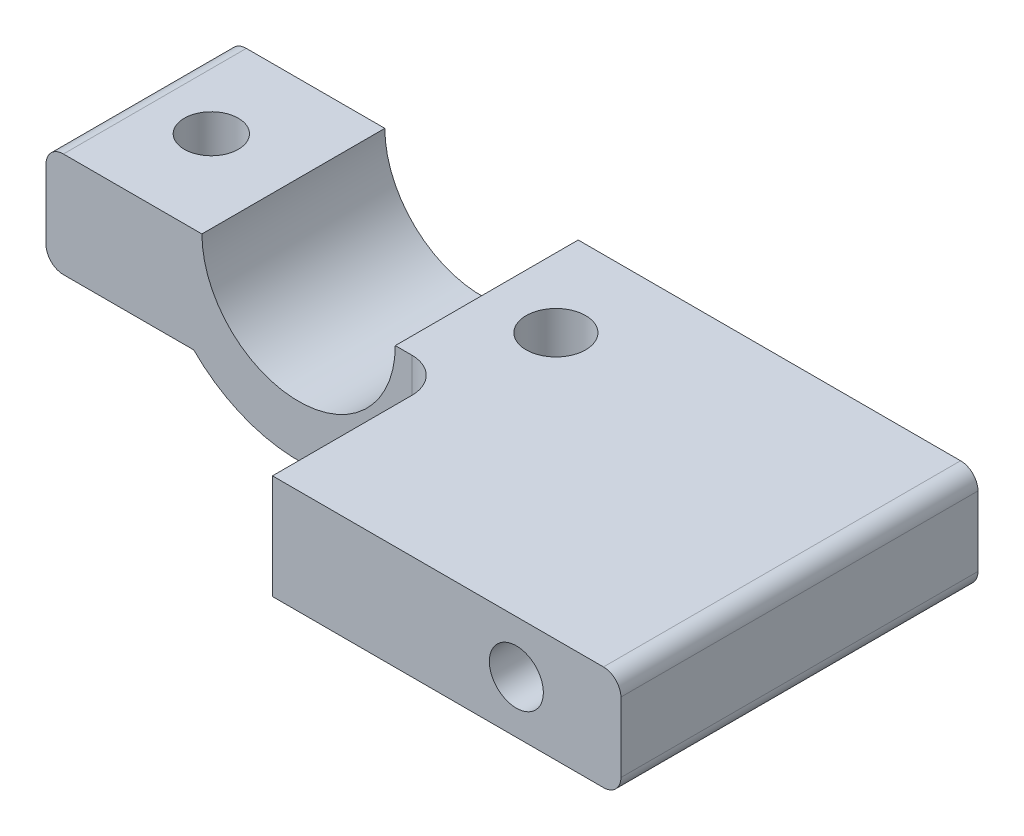
ISO-10303-21;
HEADER;
FILE_DESCRIPTION(('STEP AP214'),'2;1');
FILE_NAME('part.step','',(''),(''),'','','');
FILE_SCHEMA(('AUTOMOTIVE_DESIGN { 1 0 10303 214 1 1 1 1 }'));
ENDSEC;
DATA;
#1=APPLICATION_CONTEXT('core data for automotive mechanical design processes');
#2=APPLICATION_PROTOCOL_DEFINITION('international standard','automotive_design',2000,#1);
#3=PRODUCT_CONTEXT('',#1,'mechanical');
#4=PRODUCT('Part','Part','',(#3));
#5=PRODUCT_RELATED_PRODUCT_CATEGORY('part','',(#4));
#6=PRODUCT_DEFINITION_FORMATION('','',#4);
#7=PRODUCT_DEFINITION_CONTEXT('part definition',#1,'design');
#8=PRODUCT_DEFINITION('design','',#6,#7);
#9=PRODUCT_DEFINITION_SHAPE('','',#8);
#10=(LENGTH_UNIT() NAMED_UNIT(*) SI_UNIT(.MILLI.,.METRE.));
#11=(NAMED_UNIT(*) PLANE_ANGLE_UNIT() SI_UNIT($,.RADIAN.));
#12=(NAMED_UNIT(*) SI_UNIT($,.STERADIAN.) SOLID_ANGLE_UNIT());
#13=UNCERTAINTY_MEASURE_WITH_UNIT(LENGTH_MEASURE(1.E-05),#10,'distance_accuracy_value','');
#14=(GEOMETRIC_REPRESENTATION_CONTEXT(3) GLOBAL_UNCERTAINTY_ASSIGNED_CONTEXT((#13)) GLOBAL_UNIT_ASSIGNED_CONTEXT((#10,
#11,#12)) REPRESENTATION_CONTEXT('',''));
#15=CARTESIAN_POINT('',(0.,0.,0.));
#16=DIRECTION('',(0.,0.,1.));
#17=DIRECTION('',(1.,0.,0.));
#18=AXIS2_PLACEMENT_3D('',#15,#16,#17);
#19=CARTESIAN_POINT('',(0.,-6.,10.5));
#20=DIRECTION('',(0.,1.,0.));
#21=DIRECTION('',(0.,0.,1.));
#22=AXIS2_PLACEMENT_3D('',#19,#20,#21);
#23=PLANE('',#22);
#24=CARTESIAN_POINT('',(-10.2603986446981,-6.,5.25));
#25=DIRECTION('',(0.,-1.,0.));
#26=DIRECTION('',(0.,0.,-1.));
#27=AXIS2_PLACEMENT_3D('',#24,#25,#26);
#28=CIRCLE('',#27,1.55);
#29=CARTESIAN_POINT('',(-10.2603986446981,-6.,3.7));
#30=VERTEX_POINT('',#29);
#31=EDGE_CURVE('E199',#30,#30,#28,.T.);
#32=ORIENTED_EDGE('',*,*,#31,.F.);
#33=EDGE_LOOP('',(#32));
#34=FACE_BOUND('',#33,.T.);
#35=DIRECTION('',(1.,0.,0.));
#36=VECTOR('',#35,1.);
#37=CARTESIAN_POINT('',(0.,-6.,10.5));
#38=LINE('',#37,#36);
#39=CARTESIAN_POINT('',(-13.5,-6.,10.5));
#40=VERTEX_POINT('',#39);
#41=CARTESIAN_POINT('',(-6.02079728939615,-6.,10.5));
#42=VERTEX_POINT('',#41);
#43=EDGE_CURVE('E211',#40,#42,#38,.T.);
#44=ORIENTED_EDGE('',*,*,#43,.F.);
#45=DIRECTION('',(0.,0.,-1.));
#46=VECTOR('',#45,1.);
#47=CARTESIAN_POINT('',(-13.5,-6.,10.5));
#48=LINE('',#47,#46);
#49=CARTESIAN_POINT('',(-13.5,-6.,0.));
#50=VERTEX_POINT('',#49);
#51=EDGE_CURVE('E316',#40,#50,#48,.T.);
#52=ORIENTED_EDGE('',*,*,#51,.T.);
#53=DIRECTION('',(1.,0.,0.));
#54=VECTOR('',#53,1.);
#55=CARTESIAN_POINT('',(0.,-6.,0.));
#56=LINE('',#55,#54);
#57=CARTESIAN_POINT('',(-6.02079728939615,-6.,0.));
#58=VERTEX_POINT('',#57);
#59=EDGE_CURVE('E207',#50,#58,#56,.T.);
#60=ORIENTED_EDGE('',*,*,#59,.T.);
#61=DIRECTION('',(0.,0.,-1.));
#62=VECTOR('',#61,1.);
#63=CARTESIAN_POINT('',(-6.02079728939615,-6.,10.5));
#64=LINE('',#63,#62);
#65=EDGE_CURVE('E271',#42,#58,#64,.T.);
#66=ORIENTED_EDGE('',*,*,#65,.F.);
#67=EDGE_LOOP('',(#44,#52,#60,#66));
#68=FACE_BOUND('',#67,.T.);
#69=ADVANCED_FACE('F45',(#34,#68),#23,.F.);
#70=CARTESIAN_POINT('',(0.,0.,10.5));
#71=DIRECTION('',(0.,0.,-1.));
#72=DIRECTION('',(-1.,0.,0.));
#73=AXIS2_PLACEMENT_3D('',#70,#71,#72);
#74=CYLINDRICAL_SURFACE('',#73,8.5);
#75=CARTESIAN_POINT('',(0.,0.,0.));
#76=DIRECTION('',(0.,0.,1.));
#77=DIRECTION('',(1.,0.,0.));
#78=AXIS2_PLACEMENT_3D('',#75,#76,#77);
#79=CIRCLE('',#78,8.5);
#80=CARTESIAN_POINT('',(6.02079728939615,-6.,0.));
#81=VERTEX_POINT('',#80);
#82=EDGE_CURVE('E238',#58,#81,#79,.T.);
#83=ORIENTED_EDGE('',*,*,#82,.T.);
#84=DIRECTION('',(0.,0.,-1.));
#85=VECTOR('',#84,1.);
#86=CARTESIAN_POINT('',(6.02079728939615,-6.,10.5));
#87=LINE('',#86,#85);
#88=CARTESIAN_POINT('',(6.02079728939615,-6.,10.5));
#89=VERTEX_POINT('',#88);
#90=EDGE_CURVE('E267',#89,#81,#87,.T.);
#91=ORIENTED_EDGE('',*,*,#90,.F.);
#92=CARTESIAN_POINT('',(0.,0.,10.5));
#93=DIRECTION('',(0.,0.,1.));
#94=DIRECTION('',(1.,0.,0.));
#95=AXIS2_PLACEMENT_3D('',#92,#93,#94);
#96=CIRCLE('',#95,8.5);
#97=EDGE_CURVE('E214',#42,#89,#96,.T.);
#98=ORIENTED_EDGE('',*,*,#97,.F.);
#99=ORIENTED_EDGE('',*,*,#65,.T.);
#100=EDGE_LOOP('',(#83,#91,#98,#99));
#101=FACE_BOUND('',#100,.T.);
#102=ADVANCED_FACE('F390',(#101),#74,.T.);
#103=CARTESIAN_POINT('',(0.,-6.,10.5));
#104=DIRECTION('',(0.,-1.,0.));
#105=DIRECTION('',(1.,0.,0.));
#106=AXIS2_PLACEMENT_3D('',#103,#104,#105);
#107=PLANE('',#106);
#108=CARTESIAN_POINT('',(9.52079728939614,-6.,5.25));
#109=DIRECTION('',(0.,-1.,0.));
#110=DIRECTION('',(1.,0.,0.));
#111=AXIS2_PLACEMENT_3D('',#108,#109,#110);
#112=CIRCLE('',#111,1.70728631001392);
#113=CARTESIAN_POINT('',(11.2280835994101,-6.,5.25));
#114=VERTEX_POINT('',#113);
#115=EDGE_CURVE('E180',#114,#114,#112,.T.);
#116=ORIENTED_EDGE('',*,*,#115,.F.);
#117=EDGE_LOOP('',(#116));
#118=FACE_BOUND('',#117,.T.);
#119=DIRECTION('',(-1.,0.,0.));
#120=VECTOR('',#119,1.);
#121=CARTESIAN_POINT('',(0.,-6.,0.));
#122=LINE('',#121,#120);
#123=CARTESIAN_POINT('',(27.5,-6.,0.));
#124=VERTEX_POINT('',#123);
#125=EDGE_CURVE('E242',#124,#81,#122,.T.);
#126=ORIENTED_EDGE('',*,*,#125,.F.);
#127=DIRECTION('',(0.,0.,-1.));
#128=VECTOR('',#127,1.);
#129=CARTESIAN_POINT('',(27.5,-6.,10.5));
#130=LINE('',#129,#128);
#131=CARTESIAN_POINT('',(27.5,-6.,20.5));
#132=VERTEX_POINT('',#131);
#133=EDGE_CURVE('E313',#124,#132,#130,.F.);
#134=ORIENTED_EDGE('',*,*,#133,.T.);
#135=DIRECTION('',(1.,0.,0.));
#136=VECTOR('',#135,1.);
#137=CARTESIAN_POINT('',(28.5,-6.,20.5));
#138=LINE('',#137,#136);
#139=CARTESIAN_POINT('',(8.5,-6.,20.5));
#140=VERTEX_POINT('',#139);
#141=EDGE_CURVE('E187',#140,#132,#138,.T.);
#142=ORIENTED_EDGE('',*,*,#141,.F.);
#143=DIRECTION('',(0.,0.,-1.));
#144=VECTOR('',#143,1.);
#145=CARTESIAN_POINT('',(8.5,-6.,20.5));
#146=LINE('',#145,#144);
#147=CARTESIAN_POINT('',(8.5,-6.,12.5));
#148=VERTEX_POINT('',#147);
#149=EDGE_CURVE('E181',#140,#148,#146,.T.);
#150=ORIENTED_EDGE('',*,*,#149,.T.);
#151=CARTESIAN_POINT('',(6.5,-6.,12.5));
#152=DIRECTION('',(0.,-1.,0.));
#153=DIRECTION('',(1.,0.,0.));
#154=AXIS2_PLACEMENT_3D('',#151,#152,#153);
#155=CIRCLE('',#154,2.);
#156=CARTESIAN_POINT('',(6.5,-6.,10.5));
#157=VERTEX_POINT('',#156);
#158=EDGE_CURVE('E281',#148,#157,#155,.F.);
#159=ORIENTED_EDGE('',*,*,#158,.T.);
#160=DIRECTION('',(-1.,0.,0.));
#161=VECTOR('',#160,1.);
#162=CARTESIAN_POINT('',(0.,-6.,10.5));
#163=LINE('',#162,#161);
#164=EDGE_CURVE('E219',#157,#89,#163,.T.);
#165=ORIENTED_EDGE('',*,*,#164,.T.);
#166=ORIENTED_EDGE('',*,*,#90,.T.);
#167=EDGE_LOOP('',(#126,#134,#142,#150,#159,#165,#166));
#168=FACE_BOUND('',#167,.T.);
#169=ADVANCED_FACE('F396',(#118,#168),#107,.T.);
#170=CARTESIAN_POINT('',(28.5,0.,10.5));
#171=DIRECTION('',(1.,0.,0.));
#172=DIRECTION('',(0.,0.,-1.));
#173=AXIS2_PLACEMENT_3D('',#170,#171,#172);
#174=PLANE('',#173);
#175=DIRECTION('',(0.,-1.,0.));
#176=VECTOR('',#175,1.);
#177=CARTESIAN_POINT('',(28.5,0.,0.));
#178=LINE('',#177,#176);
#179=CARTESIAN_POINT('',(28.5,-1.,0.));
#180=VERTEX_POINT('',#179);
#181=CARTESIAN_POINT('',(28.5,-5.,0.));
#182=VERTEX_POINT('',#181);
#183=EDGE_CURVE('E245',#180,#182,#178,.T.);
#184=ORIENTED_EDGE('',*,*,#183,.F.);
#185=DIRECTION('',(0.,0.,-1.));
#186=VECTOR('',#185,1.);
#187=CARTESIAN_POINT('',(28.5,-1.,10.5));
#188=LINE('',#187,#186);
#189=CARTESIAN_POINT('',(28.5,-1.,20.5));
#190=VERTEX_POINT('',#189);
#191=EDGE_CURVE('E305',#180,#190,#188,.F.);
#192=ORIENTED_EDGE('',*,*,#191,.T.);
#193=DIRECTION('',(0.,1.,0.));
#194=VECTOR('',#193,1.);
#195=CARTESIAN_POINT('',(28.5,-6.,20.5));
#196=LINE('',#195,#194);
#197=CARTESIAN_POINT('',(28.5,-5.,20.5));
#198=VERTEX_POINT('',#197);
#199=EDGE_CURVE('E168',#198,#190,#196,.T.);
#200=ORIENTED_EDGE('',*,*,#199,.F.);
#201=DIRECTION('',(0.,0.,-1.));
#202=VECTOR('',#201,1.);
#203=CARTESIAN_POINT('',(28.5,-5.,10.5));
#204=LINE('',#203,#202);
#205=EDGE_CURVE('E301',#198,#182,#204,.T.);
#206=ORIENTED_EDGE('',*,*,#205,.T.);
#207=EDGE_LOOP('',(#184,#192,#200,#206));
#208=FACE_BOUND('',#207,.T.);
#209=ADVANCED_FACE('F362',(#208),#174,.T.);
#210=CARTESIAN_POINT('',(0.,0.,10.5));
#211=DIRECTION('',(0.,1.,0.));
#212=DIRECTION('',(0.,0.,1.));
#213=AXIS2_PLACEMENT_3D('',#210,#211,#212);
#214=PLANE('',#213);
#215=CARTESIAN_POINT('',(9.52079728939614,0.,5.25));
#216=DIRECTION('',(0.,-1.,0.));
#217=DIRECTION('',(1.,0.,0.));
#218=AXIS2_PLACEMENT_3D('',#215,#216,#217);
#219=CIRCLE('',#218,1.70728631001392);
#220=CARTESIAN_POINT('',(11.2280835994101,0.,5.25));
#221=VERTEX_POINT('',#220);
#222=EDGE_CURVE('E195',#221,#221,#219,.T.);
#223=ORIENTED_EDGE('',*,*,#222,.T.);
#224=EDGE_LOOP('',(#223));
#225=FACE_BOUND('',#224,.T.);
#226=DIRECTION('',(-1.,0.,0.));
#227=VECTOR('',#226,1.);
#228=CARTESIAN_POINT('',(28.5,0.,20.5));
#229=LINE('',#228,#227);
#230=CARTESIAN_POINT('',(27.5,0.,20.5));
#231=VERTEX_POINT('',#230);
#232=CARTESIAN_POINT('',(8.5,0.,20.5));
#233=VERTEX_POINT('',#232);
#234=EDGE_CURVE('E154',#231,#233,#229,.T.);
#235=ORIENTED_EDGE('',*,*,#234,.F.);
#236=DIRECTION('',(0.,0.,-1.));
#237=VECTOR('',#236,1.);
#238=CARTESIAN_POINT('',(27.5,0.,10.5));
#239=LINE('',#238,#237);
#240=CARTESIAN_POINT('',(27.5,0.,0.));
#241=VERTEX_POINT('',#240);
#242=EDGE_CURVE('E286',#231,#241,#239,.T.);
#243=ORIENTED_EDGE('',*,*,#242,.T.);
#244=DIRECTION('',(1.,0.,0.));
#245=VECTOR('',#244,1.);
#246=CARTESIAN_POINT('',(0.,0.,0.));
#247=LINE('',#246,#245);
#248=CARTESIAN_POINT('',(5.55,0.,0.));
#249=VERTEX_POINT('',#248);
#250=EDGE_CURVE('E249',#249,#241,#247,.T.);
#251=ORIENTED_EDGE('',*,*,#250,.F.);
#252=DIRECTION('',(0.,0.,-1.));
#253=VECTOR('',#252,1.);
#254=CARTESIAN_POINT('',(5.55,0.,10.5));
#255=LINE('',#254,#253);
#256=CARTESIAN_POINT('',(5.55,0.,10.5));
#257=VERTEX_POINT('',#256);
#258=EDGE_CURVE('E264',#257,#249,#255,.T.);
#259=ORIENTED_EDGE('',*,*,#258,.F.);
#260=DIRECTION('',(1.,0.,0.));
#261=VECTOR('',#260,1.);
#262=CARTESIAN_POINT('',(0.,0.,10.5));
#263=LINE('',#262,#261);
#264=CARTESIAN_POINT('',(6.5,0.,10.5));
#265=VERTEX_POINT('',#264);
#266=EDGE_CURVE('E222',#257,#265,#263,.T.);
#267=ORIENTED_EDGE('',*,*,#266,.T.);
#268=CARTESIAN_POINT('',(6.5,0.,12.5));
#269=DIRECTION('',(0.,1.,0.));
#270=DIRECTION('',(0.,0.,1.));
#271=AXIS2_PLACEMENT_3D('',#268,#269,#270);
#272=CIRCLE('',#271,2.);
#273=CARTESIAN_POINT('',(8.5,0.,12.5));
#274=VERTEX_POINT('',#273);
#275=EDGE_CURVE('E175',#265,#274,#272,.F.);
#276=ORIENTED_EDGE('',*,*,#275,.T.);
#277=DIRECTION('',(0.,0.,-1.));
#278=VECTOR('',#277,1.);
#279=CARTESIAN_POINT('',(8.5,0.,20.5));
#280=LINE('',#279,#278);
#281=EDGE_CURVE('E171',#233,#274,#280,.T.);
#282=ORIENTED_EDGE('',*,*,#281,.F.);
#283=EDGE_LOOP('',(#235,#243,#251,#259,#267,#276,#282));
#284=FACE_BOUND('',#283,.T.);
#285=ADVANCED_FACE('F172',(#225,#284),#214,.T.);
#286=CARTESIAN_POINT('',(0.,0.,10.5));
#287=DIRECTION('',(0.,0.,-1.));
#288=DIRECTION('',(-1.,0.,0.));
#289=AXIS2_PLACEMENT_3D('',#286,#287,#288);
#290=CYLINDRICAL_SURFACE('',#289,5.55);
#291=CARTESIAN_POINT('',(0.,0.,0.));
#292=DIRECTION('',(0.,0.,1.));
#293=DIRECTION('',(1.,0.,0.));
#294=AXIS2_PLACEMENT_3D('',#291,#292,#293);
#295=CIRCLE('',#294,5.55);
#296=CARTESIAN_POINT('',(-5.55,0.,0.));
#297=VERTEX_POINT('',#296);
#298=EDGE_CURVE('E253',#297,#249,#295,.T.);
#299=ORIENTED_EDGE('',*,*,#298,.F.);
#300=DIRECTION('',(0.,0.,-1.));
#301=VECTOR('',#300,1.);
#302=CARTESIAN_POINT('',(-5.55,0.,10.5));
#303=LINE('',#302,#301);
#304=CARTESIAN_POINT('',(-5.55,0.,10.5));
#305=VERTEX_POINT('',#304);
#306=EDGE_CURVE('E235',#305,#297,#303,.T.);
#307=ORIENTED_EDGE('',*,*,#306,.F.);
#308=CARTESIAN_POINT('',(0.,0.,10.5));
#309=DIRECTION('',(0.,0.,1.));
#310=DIRECTION('',(1.,0.,0.));
#311=AXIS2_PLACEMENT_3D('',#308,#309,#310);
#312=CIRCLE('',#311,5.55);
#313=EDGE_CURVE('E225',#305,#257,#312,.T.);
#314=ORIENTED_EDGE('',*,*,#313,.T.);
#315=ORIENTED_EDGE('',*,*,#258,.T.);
#316=EDGE_LOOP('',(#299,#307,#314,#315));
#317=FACE_BOUND('',#316,.T.);
#318=ADVANCED_FACE('F353',(#317),#290,.F.);
#319=CARTESIAN_POINT('',(0.,0.,10.5));
#320=DIRECTION('',(0.,-1.,0.));
#321=DIRECTION('',(1.,0.,0.));
#322=AXIS2_PLACEMENT_3D('',#319,#320,#321);
#323=PLANE('',#322);
#324=CARTESIAN_POINT('',(-10.2603986446981,0.,5.25));
#325=DIRECTION('',(0.,-1.,0.));
#326=DIRECTION('',(0.,0.,-1.));
#327=AXIS2_PLACEMENT_3D('',#324,#325,#326);
#328=CIRCLE('',#327,1.55);
#329=CARTESIAN_POINT('',(-10.2603986446981,0.,3.7));
#330=VERTEX_POINT('',#329);
#331=EDGE_CURVE('E203',#330,#330,#328,.T.);
#332=ORIENTED_EDGE('',*,*,#331,.T.);
#333=EDGE_LOOP('',(#332));
#334=FACE_BOUND('',#333,.T.);
#335=DIRECTION('',(-1.,0.,0.));
#336=VECTOR('',#335,1.);
#337=CARTESIAN_POINT('',(0.,0.,0.));
#338=LINE('',#337,#336);
#339=CARTESIAN_POINT('',(-13.5,0.,0.));
#340=VERTEX_POINT('',#339);
#341=EDGE_CURVE('E257',#297,#340,#338,.T.);
#342=ORIENTED_EDGE('',*,*,#341,.T.);
#343=DIRECTION('',(0.,0.,-1.));
#344=VECTOR('',#343,1.);
#345=CARTESIAN_POINT('',(-13.5,0.,10.5));
#346=LINE('',#345,#344);
#347=CARTESIAN_POINT('',(-13.5,0.,10.5));
#348=VERTEX_POINT('',#347);
#349=EDGE_CURVE('E11',#340,#348,#346,.F.);
#350=ORIENTED_EDGE('',*,*,#349,.T.);
#351=DIRECTION('',(-1.,0.,0.));
#352=VECTOR('',#351,1.);
#353=CARTESIAN_POINT('',(0.,0.,10.5));
#354=LINE('',#353,#352);
#355=EDGE_CURVE('E229',#305,#348,#354,.T.);
#356=ORIENTED_EDGE('',*,*,#355,.F.);
#357=ORIENTED_EDGE('',*,*,#306,.T.);
#358=EDGE_LOOP('',(#342,#350,#356,#357));
#359=FACE_BOUND('',#358,.T.);
#360=ADVANCED_FACE('F350',(#334,#359),#323,.F.);
#361=CARTESIAN_POINT('',(-14.5,0.,10.5));
#362=DIRECTION('',(1.,0.,0.));
#363=DIRECTION('',(0.,0.,-1.));
#364=AXIS2_PLACEMENT_3D('',#361,#362,#363);
#365=PLANE('',#364);
#366=DIRECTION('',(0.,-1.,0.));
#367=VECTOR('',#366,1.);
#368=CARTESIAN_POINT('',(-14.5,0.,0.));
#369=LINE('',#368,#367);
#370=CARTESIAN_POINT('',(-14.5,-1.,0.));
#371=VERTEX_POINT('',#370);
#372=CARTESIAN_POINT('',(-14.5,-5.,0.));
#373=VERTEX_POINT('',#372);
#374=EDGE_CURVE('E215',#371,#373,#369,.T.);
#375=ORIENTED_EDGE('',*,*,#374,.T.);
#376=DIRECTION('',(0.,0.,-1.));
#377=VECTOR('',#376,1.);
#378=CARTESIAN_POINT('',(-14.5,-5.,10.5));
#379=LINE('',#378,#377);
#380=CARTESIAN_POINT('',(-14.5,-5.,10.5));
#381=VERTEX_POINT('',#380);
#382=EDGE_CURVE('E67',#373,#381,#379,.F.);
#383=ORIENTED_EDGE('',*,*,#382,.T.);
#384=DIRECTION('',(0.,-1.,0.));
#385=VECTOR('',#384,1.);
#386=CARTESIAN_POINT('',(-14.5,0.,10.5));
#387=LINE('',#386,#385);
#388=CARTESIAN_POINT('',(-14.5,-1.,10.5));
#389=VERTEX_POINT('',#388);
#390=EDGE_CURVE('E232',#389,#381,#387,.T.);
#391=ORIENTED_EDGE('',*,*,#390,.F.);
#392=DIRECTION('',(0.,0.,-1.));
#393=VECTOR('',#392,1.);
#394=CARTESIAN_POINT('',(-14.5,-1.,10.5));
#395=LINE('',#394,#393);
#396=EDGE_CURVE('E320',#389,#371,#395,.T.);
#397=ORIENTED_EDGE('',*,*,#396,.T.);
#398=EDGE_LOOP('',(#375,#383,#391,#397));
#399=FACE_BOUND('',#398,.T.);
#400=ADVANCED_FACE('F344',(#399),#365,.F.);
#401=CARTESIAN_POINT('',(0.,0.,10.5));
#402=DIRECTION('',(0.,0.,1.));
#403=DIRECTION('',(1.,0.,0.));
#404=AXIS2_PLACEMENT_3D('',#401,#402,#403);
#405=PLANE('',#404);
#406=ORIENTED_EDGE('',*,*,#390,.T.);
#407=CARTESIAN_POINT('',(-13.5,-5.,10.5));
#408=DIRECTION('',(0.,0.,1.));
#409=DIRECTION('',(1.,0.,0.));
#410=AXIS2_PLACEMENT_3D('',#407,#408,#409);
#411=CIRCLE('',#410,1.);
#412=EDGE_CURVE('E54',#381,#40,#411,.T.);
#413=ORIENTED_EDGE('',*,*,#412,.T.);
#414=ORIENTED_EDGE('',*,*,#43,.T.);
#415=ORIENTED_EDGE('',*,*,#97,.T.);
#416=ORIENTED_EDGE('',*,*,#164,.F.);
#417=DIRECTION('',(0.,-1.,0.));
#418=VECTOR('',#417,1.);
#419=CARTESIAN_POINT('',(6.5,0.,10.5));
#420=LINE('',#419,#418);
#421=EDGE_CURVE('E278',#157,#265,#420,.F.);
#422=ORIENTED_EDGE('',*,*,#421,.T.);
#423=ORIENTED_EDGE('',*,*,#266,.F.);
#424=ORIENTED_EDGE('',*,*,#313,.F.);
#425=ORIENTED_EDGE('',*,*,#355,.T.);
#426=CARTESIAN_POINT('',(-13.5,-1.,10.5));
#427=DIRECTION('',(0.,0.,1.));
#428=DIRECTION('',(1.,0.,0.));
#429=AXIS2_PLACEMENT_3D('',#426,#427,#428);
#430=CIRCLE('',#429,1.);
#431=EDGE_CURVE('E326',#348,#389,#430,.T.);
#432=ORIENTED_EDGE('',*,*,#431,.T.);
#433=EDGE_LOOP('',(#406,#413,#414,#415,#416,#422,#423,#424,#425,#432));
#434=FACE_BOUND('',#433,.T.);
#435=ADVANCED_FACE('F332',(#434),#405,.T.);
#436=CARTESIAN_POINT('',(0.,0.,0.));
#437=DIRECTION('',(0.,0.,1.));
#438=DIRECTION('',(1.,0.,0.));
#439=AXIS2_PLACEMENT_3D('',#436,#437,#438);
#440=PLANE('',#439);
#441=ORIENTED_EDGE('',*,*,#250,.T.);
#442=CARTESIAN_POINT('',(27.5,-1.,0.));
#443=DIRECTION('',(0.,0.,1.));
#444=DIRECTION('',(1.,0.,0.));
#445=AXIS2_PLACEMENT_3D('',#442,#443,#444);
#446=CIRCLE('',#445,1.);
#447=EDGE_CURVE('E298',#241,#180,#446,.F.);
#448=ORIENTED_EDGE('',*,*,#447,.T.);
#449=ORIENTED_EDGE('',*,*,#183,.T.);
#450=CARTESIAN_POINT('',(27.5,-5.,0.));
#451=DIRECTION('',(0.,0.,1.));
#452=DIRECTION('',(1.,0.,0.));
#453=AXIS2_PLACEMENT_3D('',#450,#451,#452);
#454=CIRCLE('',#453,1.);
#455=EDGE_CURVE('E295',#182,#124,#454,.F.);
#456=ORIENTED_EDGE('',*,*,#455,.T.);
#457=ORIENTED_EDGE('',*,*,#125,.T.);
#458=ORIENTED_EDGE('',*,*,#82,.F.);
#459=ORIENTED_EDGE('',*,*,#59,.F.);
#460=CARTESIAN_POINT('',(-13.5,-5.,0.));
#461=DIRECTION('',(0.,0.,1.));
#462=DIRECTION('',(1.,0.,0.));
#463=AXIS2_PLACEMENT_3D('',#460,#461,#462);
#464=CIRCLE('',#463,1.);
#465=EDGE_CURVE('E292',#50,#373,#464,.F.);
#466=ORIENTED_EDGE('',*,*,#465,.T.);
#467=ORIENTED_EDGE('',*,*,#374,.F.);
#468=CARTESIAN_POINT('',(-13.5,-1.,0.));
#469=DIRECTION('',(0.,0.,1.));
#470=DIRECTION('',(1.,0.,0.));
#471=AXIS2_PLACEMENT_3D('',#468,#469,#470);
#472=CIRCLE('',#471,1.);
#473=EDGE_CURVE('E289',#371,#340,#472,.F.);
#474=ORIENTED_EDGE('',*,*,#473,.T.);
#475=ORIENTED_EDGE('',*,*,#341,.F.);
#476=ORIENTED_EDGE('',*,*,#298,.T.);
#477=EDGE_LOOP('',(#441,#448,#449,#456,#457,#458,#459,#466,#467,#474,#475,#476));
#478=FACE_BOUND('',#477,.T.);
#479=ADVANCED_FACE('F342',(#478),#440,.F.);
#480=CARTESIAN_POINT('',(-10.2603986446981,0.,5.25));
#481=DIRECTION('',(0.,-1.,0.));
#482=DIRECTION('',(0.,0.,-1.));
#483=AXIS2_PLACEMENT_3D('',#480,#481,#482);
#484=CYLINDRICAL_SURFACE('',#483,1.55);
#485=CARTESIAN_POINT('',(-10.2603986446981,0.,3.7));
#486=CARTESIAN_POINT('',(-10.2603986446981,-0.0624999999999999,3.7));
#487=CARTESIAN_POINT('',(-10.2603986446981,-0.125,3.7));
#488=CARTESIAN_POINT('',(-10.2603986446981,-0.25,3.7));
#489=CARTESIAN_POINT('',(-10.2603986446981,-0.3125,3.7));
#490=CARTESIAN_POINT('',(-10.2603986446981,-0.4375,3.7));
#491=CARTESIAN_POINT('',(-10.2603986446981,-0.5,3.7));
#492=CARTESIAN_POINT('',(-10.2603986446981,-0.625,3.7));
#493=CARTESIAN_POINT('',(-10.2603986446981,-0.6875,3.7));
#494=CARTESIAN_POINT('',(-10.2603986446981,-0.8125,3.7));
#495=CARTESIAN_POINT('',(-10.2603986446981,-0.875,3.7));
#496=CARTESIAN_POINT('',(-10.2603986446981,-1.,3.7));
#497=CARTESIAN_POINT('',(-10.2603986446981,-1.0625,3.7));
#498=CARTESIAN_POINT('',(-10.2603986446981,-1.1875,3.7));
#499=CARTESIAN_POINT('',(-10.2603986446981,-1.25,3.7));
#500=CARTESIAN_POINT('',(-10.2603986446981,-1.375,3.7));
#501=CARTESIAN_POINT('',(-10.2603986446981,-1.4375,3.7));
#502=CARTESIAN_POINT('',(-10.2603986446981,-1.5625,3.7));
#503=CARTESIAN_POINT('',(-10.2603986446981,-1.625,3.7));
#504=CARTESIAN_POINT('',(-10.2603986446981,-1.75,3.7));
#505=CARTESIAN_POINT('',(-10.2603986446981,-1.8125,3.7));
#506=CARTESIAN_POINT('',(-10.2603986446981,-1.9375,3.7));
#507=CARTESIAN_POINT('',(-10.2603986446981,-2.,3.7));
#508=CARTESIAN_POINT('',(-10.2603986446981,-2.125,3.7));
#509=CARTESIAN_POINT('',(-10.2603986446981,-2.1875,3.7));
#510=CARTESIAN_POINT('',(-10.2603986446981,-2.3125,3.7));
#511=CARTESIAN_POINT('',(-10.2603986446981,-2.375,3.7));
#512=CARTESIAN_POINT('',(-10.2603986446981,-2.5,3.7));
#513=CARTESIAN_POINT('',(-10.2603986446981,-2.5625,3.7));
#514=CARTESIAN_POINT('',(-10.2603986446981,-2.6875,3.7));
#515=CARTESIAN_POINT('',(-10.2603986446981,-2.75,3.7));
#516=CARTESIAN_POINT('',(-10.2603986446981,-2.875,3.7));
#517=CARTESIAN_POINT('',(-10.2603986446981,-2.9375,3.7));
#518=CARTESIAN_POINT('',(-10.2603986446981,-3.0625,3.7));
#519=CARTESIAN_POINT('',(-10.2603986446981,-3.125,3.7));
#520=CARTESIAN_POINT('',(-10.2603986446981,-3.25,3.7));
#521=CARTESIAN_POINT('',(-10.2603986446981,-3.3125,3.7));
#522=CARTESIAN_POINT('',(-10.2603986446981,-3.4375,3.7));
#523=CARTESIAN_POINT('',(-10.2603986446981,-3.5,3.7));
#524=CARTESIAN_POINT('',(-10.2603986446981,-3.625,3.7));
#525=CARTESIAN_POINT('',(-10.2603986446981,-3.6875,3.7));
#526=CARTESIAN_POINT('',(-10.2603986446981,-3.8125,3.7));
#527=CARTESIAN_POINT('',(-10.2603986446981,-3.875,3.7));
#528=CARTESIAN_POINT('',(-10.2603986446981,-4.,3.7));
#529=CARTESIAN_POINT('',(-10.2603986446981,-4.0625,3.7));
#530=CARTESIAN_POINT('',(-10.2603986446981,-4.1875,3.7));
#531=CARTESIAN_POINT('',(-10.2603986446981,-4.25,3.7));
#532=CARTESIAN_POINT('',(-10.2603986446981,-4.375,3.7));
#533=CARTESIAN_POINT('',(-10.2603986446981,-4.4375,3.7));
#534=CARTESIAN_POINT('',(-10.2603986446981,-4.5625,3.7));
#535=CARTESIAN_POINT('',(-10.2603986446981,-4.625,3.7));
#536=CARTESIAN_POINT('',(-10.2603986446981,-4.75,3.7));
#537=CARTESIAN_POINT('',(-10.2603986446981,-4.8125,3.7));
#538=CARTESIAN_POINT('',(-10.2603986446981,-4.9375,3.7));
#539=CARTESIAN_POINT('',(-10.2603986446981,-5.,3.7));
#540=CARTESIAN_POINT('',(-10.2603986446981,-5.125,3.7));
#541=CARTESIAN_POINT('',(-10.2603986446981,-5.1875,3.7));
#542=CARTESIAN_POINT('',(-10.2603986446981,-5.3125,3.7));
#543=CARTESIAN_POINT('',(-10.2603986446981,-5.375,3.7));
#544=CARTESIAN_POINT('',(-10.2603986446981,-5.5,3.7));
#545=CARTESIAN_POINT('',(-10.2603986446981,-5.5625,3.7));
#546=CARTESIAN_POINT('',(-10.2603986446981,-5.6875,3.7));
#547=CARTESIAN_POINT('',(-10.2603986446981,-5.75,3.7));
#548=CARTESIAN_POINT('',(-10.2603986446981,-5.875,3.7));
#549=CARTESIAN_POINT('',(-10.2603986446981,-5.9375,3.7));
#550=CARTESIAN_POINT('',(-10.2603986446981,-6.,3.7));
#551=B_SPLINE_CURVE_WITH_KNOTS('',3,(#485,#486,#487,#488,#489,#490,#491,#492,#493,#494,#495,
#496,#497,#498,#499,#500,#501,#502,#503,#504,#505,#506,#507,#508,#509,#510,#511,#512,#513,#514,
#515,#516,#517,#518,#519,#520,#521,#522,#523,#524,#525,#526,#527,#528,#529,#530,#531,#532,#533,
#534,#535,#536,#537,#538,#539,#540,#541,#542,#543,#544,#545,#546,#547,#548,#549,#550),
.UNSPECIFIED.,.F.,.F.,(4,2,2,2,2,2,2,2,2,2,2,2,2,2,2,2,2,2,2,2,2,2,2,2,2,2,2,2,2,2,2,2,4),(0.,
0.1875,0.375,0.5625,0.75,0.9375,1.125,1.3125,1.5,1.6875,1.875,2.0625,2.25,2.4375,2.625,2.8125,
3.,3.1875,3.375,3.5625,3.75,3.9375,4.125,4.3125,4.5,4.6875,4.875,5.0625,5.25,5.4375,5.625,
5.8125,6.),.UNSPECIFIED.);
#552=EDGE_CURVE('BSEAM454',#330,#30,#551,.T.);
#553=ORIENTED_EDGE('',*,*,#331,.F.);
#554=ORIENTED_EDGE('',*,*,#31,.T.);
#555=ORIENTED_EDGE('',*,*,#552,.T.);
#556=ORIENTED_EDGE('',*,*,#552,.F.);
#557=EDGE_LOOP('',(#553,#555,#554,#556));
#558=FACE_BOUND('',#557,.T.);
#559=ADVANCED_FACE('F454',(#558),#484,.F.);
#560=CARTESIAN_POINT('',(9.52079728939614,0.,5.25));
#561=DIRECTION('',(0.,-1.,0.));
#562=DIRECTION('',(1.,0.,0.));
#563=AXIS2_PLACEMENT_3D('',#560,#561,#562);
#564=CYLINDRICAL_SURFACE('',#563,1.70728631001392);
#565=ORIENTED_EDGE('',*,*,#222,.F.);
#566=EDGE_LOOP('',(#565));
#567=FACE_BOUND('',#566,.T.);
#568=ORIENTED_EDGE('',*,*,#115,.T.);
#569=EDGE_LOOP('',(#568));
#570=FACE_BOUND('',#569,.T.);
#571=ADVANCED_FACE('F387',(#567,#570),#564,.F.);
#572=CARTESIAN_POINT('',(8.5,-6.,20.5));
#573=DIRECTION('',(1.,0.,0.));
#574=DIRECTION('',(0.,0.,-1.));
#575=AXIS2_PLACEMENT_3D('',#572,#573,#574);
#576=PLANE('',#575);
#577=ORIENTED_EDGE('',*,*,#281,.T.);
#578=DIRECTION('',(0.,-1.,0.));
#579=VECTOR('',#578,1.);
#580=CARTESIAN_POINT('',(8.5,-6.,12.5));
#581=LINE('',#580,#579);
#582=EDGE_CURVE('E275',#274,#148,#581,.T.);
#583=ORIENTED_EDGE('',*,*,#582,.T.);
#584=ORIENTED_EDGE('',*,*,#149,.F.);
#585=DIRECTION('',(0.,-1.,0.));
#586=VECTOR('',#585,1.);
#587=CARTESIAN_POINT('',(8.5,-6.,20.5));
#588=LINE('',#587,#586);
#589=EDGE_CURVE('E160',#233,#140,#588,.T.);
#590=ORIENTED_EDGE('',*,*,#589,.F.);
#591=EDGE_LOOP('',(#577,#583,#584,#590));
#592=FACE_BOUND('',#591,.T.);
#593=ADVANCED_FACE('F183',(#592),#576,.F.);
#594=CARTESIAN_POINT('',(0.,0.,20.5));
#595=DIRECTION('',(0.,0.,1.));
#596=DIRECTION('',(1.,0.,0.));
#597=AXIS2_PLACEMENT_3D('',#594,#595,#596);
#598=PLANE('',#597);
#599=CARTESIAN_POINT('',(22.5,-3.,20.5));
#600=DIRECTION('',(0.,0.,1.));
#601=DIRECTION('',(1.,0.,0.));
#602=AXIS2_PLACEMENT_3D('',#599,#600,#601);
#603=CIRCLE('',#602,1.55000000000113);
#604=CARTESIAN_POINT('',(24.0500000000011,-3.,20.5));
#605=VERTEX_POINT('',#604);
#606=EDGE_CURVE('E369',#605,#605,#603,.T.);
#607=ORIENTED_EDGE('',*,*,#606,.F.);
#608=EDGE_LOOP('',(#607));
#609=FACE_BOUND('',#608,.T.);
#610=ORIENTED_EDGE('',*,*,#199,.T.);
#611=CARTESIAN_POINT('',(27.5,-1.,20.5));
#612=DIRECTION('',(0.,0.,1.));
#613=DIRECTION('',(1.,0.,0.));
#614=AXIS2_PLACEMENT_3D('',#611,#612,#613);
#615=CIRCLE('',#614,1.);
#616=EDGE_CURVE('E163',#190,#231,#615,.T.);
#617=ORIENTED_EDGE('',*,*,#616,.T.);
#618=ORIENTED_EDGE('',*,*,#234,.T.);
#619=ORIENTED_EDGE('',*,*,#589,.T.);
#620=ORIENTED_EDGE('',*,*,#141,.T.);
#621=CARTESIAN_POINT('',(27.5,-5.,20.5));
#622=DIRECTION('',(0.,0.,1.));
#623=DIRECTION('',(1.,0.,0.));
#624=AXIS2_PLACEMENT_3D('',#621,#622,#623);
#625=CIRCLE('',#624,1.);
#626=EDGE_CURVE('E308',#132,#198,#625,.T.);
#627=ORIENTED_EDGE('',*,*,#626,.T.);
#628=EDGE_LOOP('',(#610,#617,#618,#619,#620,#627));
#629=FACE_BOUND('',#628,.T.);
#630=ADVANCED_FACE('F157',(#609,#629),#598,.T.);
#631=CARTESIAN_POINT('',(22.5,-3.,10.5));
#632=DIRECTION('',(0.,0.,1.));
#633=DIRECTION('',(1.,0.,0.));
#634=AXIS2_PLACEMENT_3D('',#631,#632,#633);
#635=CYLINDRICAL_SURFACE('',#634,1.55000000000113);
#636=CARTESIAN_POINT('',(22.5,-3.,10.5));
#637=DIRECTION('',(0.,0.,1.));
#638=DIRECTION('',(1.,0.,0.));
#639=AXIS2_PLACEMENT_3D('',#636,#637,#638);
#640=CIRCLE('',#639,1.55000000000113);
#641=CARTESIAN_POINT('',(24.0500000000011,-3.,10.5));
#642=VERTEX_POINT('',#641);
#643=EDGE_CURVE('E366',#642,#642,#640,.T.);
#644=ORIENTED_EDGE('',*,*,#643,.F.);
#645=EDGE_LOOP('',(#644));
#646=FACE_BOUND('',#645,.T.);
#647=ORIENTED_EDGE('',*,*,#606,.T.);
#648=EDGE_LOOP('',(#647));
#649=FACE_BOUND('',#648,.T.);
#650=ADVANCED_FACE('F376',(#646,#649),#635,.F.);
#651=CARTESIAN_POINT('',(22.5,-3.,10.5));
#652=DIRECTION('',(0.,0.,1.));
#653=DIRECTION('',(1.,0.,0.));
#654=AXIS2_PLACEMENT_3D('',#651,#652,#653);
#655=PLANE('',#654);
#656=ORIENTED_EDGE('',*,*,#643,.T.);
#657=EDGE_LOOP('',(#656));
#658=FACE_BOUND('',#657,.T.);
#659=ADVANCED_FACE('F384',(#658),#655,.T.);
#660=CARTESIAN_POINT('',(6.5,-6.,12.5));
#661=DIRECTION('',(0.,-1.,0.));
#662=DIRECTION('',(0.,0.,-1.));
#663=AXIS2_PLACEMENT_3D('',#660,#661,#662);
#664=CYLINDRICAL_SURFACE('',#663,2.);
#665=ORIENTED_EDGE('',*,*,#275,.F.);
#666=ORIENTED_EDGE('',*,*,#421,.F.);
#667=ORIENTED_EDGE('',*,*,#158,.F.);
#668=ORIENTED_EDGE('',*,*,#582,.F.);
#669=EDGE_LOOP('',(#665,#666,#667,#668));
#670=FACE_BOUND('',#669,.T.);
#671=ADVANCED_FACE('F402',(#670),#664,.F.);
#672=CARTESIAN_POINT('',(27.5,-1.,10.5));
#673=DIRECTION('',(0.,0.,-1.));
#674=DIRECTION('',(-1.,0.,0.));
#675=AXIS2_PLACEMENT_3D('',#672,#673,#674);
#676=CYLINDRICAL_SURFACE('',#675,1.);
#677=ORIENTED_EDGE('',*,*,#616,.F.);
#678=ORIENTED_EDGE('',*,*,#191,.F.);
#679=ORIENTED_EDGE('',*,*,#447,.F.);
#680=ORIENTED_EDGE('',*,*,#242,.F.);
#681=EDGE_LOOP('',(#677,#678,#679,#680));
#682=FACE_BOUND('',#681,.T.);
#683=ADVANCED_FACE('F358',(#682),#676,.T.);
#684=CARTESIAN_POINT('',(27.5,-5.,10.5));
#685=DIRECTION('',(0.,0.,-1.));
#686=DIRECTION('',(-1.,0.,0.));
#687=AXIS2_PLACEMENT_3D('',#684,#685,#686);
#688=CYLINDRICAL_SURFACE('',#687,1.);
#689=ORIENTED_EDGE('',*,*,#626,.F.);
#690=ORIENTED_EDGE('',*,*,#133,.F.);
#691=ORIENTED_EDGE('',*,*,#455,.F.);
#692=ORIENTED_EDGE('',*,*,#205,.F.);
#693=EDGE_LOOP('',(#689,#690,#691,#692));
#694=FACE_BOUND('',#693,.T.);
#695=ADVANCED_FACE('F408',(#694),#688,.T.);
#696=CARTESIAN_POINT('',(-13.5,-5.,10.5));
#697=DIRECTION('',(0.,0.,-1.));
#698=DIRECTION('',(-1.,0.,0.));
#699=AXIS2_PLACEMENT_3D('',#696,#697,#698);
#700=CYLINDRICAL_SURFACE('',#699,1.);
#701=ORIENTED_EDGE('',*,*,#412,.F.);
#702=ORIENTED_EDGE('',*,*,#382,.F.);
#703=ORIENTED_EDGE('',*,*,#465,.F.);
#704=ORIENTED_EDGE('',*,*,#51,.F.);
#705=EDGE_LOOP('',(#701,#702,#703,#704));
#706=FACE_BOUND('',#705,.T.);
#707=ADVANCED_FACE('F339',(#706),#700,.T.);
#708=CARTESIAN_POINT('',(-13.5,-1.,10.5));
#709=DIRECTION('',(0.,0.,-1.));
#710=DIRECTION('',(-1.,0.,0.));
#711=AXIS2_PLACEMENT_3D('',#708,#709,#710);
#712=CYLINDRICAL_SURFACE('',#711,1.);
#713=ORIENTED_EDGE('',*,*,#431,.F.);
#714=ORIENTED_EDGE('',*,*,#349,.F.);
#715=ORIENTED_EDGE('',*,*,#473,.F.);
#716=ORIENTED_EDGE('',*,*,#396,.F.);
#717=EDGE_LOOP('',(#713,#714,#715,#716));
#718=FACE_BOUND('',#717,.T.);
#719=ADVANCED_FACE('F47',(#718),#712,.T.);
#720=CLOSED_SHELL('',(#69,#102,#169,#209,#285,#318,#360,#400,#435,#479,#559,#571,#593,#630,#650,
#659,#671,#683,#695,#707,#719));
#721=MANIFOLD_SOLID_BREP('B2',#720);
#722=ADVANCED_BREP_SHAPE_REPRESENTATION('',(#18,#721),#14);
#723=SHAPE_DEFINITION_REPRESENTATION(#9,#722);
ENDSEC;
END-ISO-10303-21;
